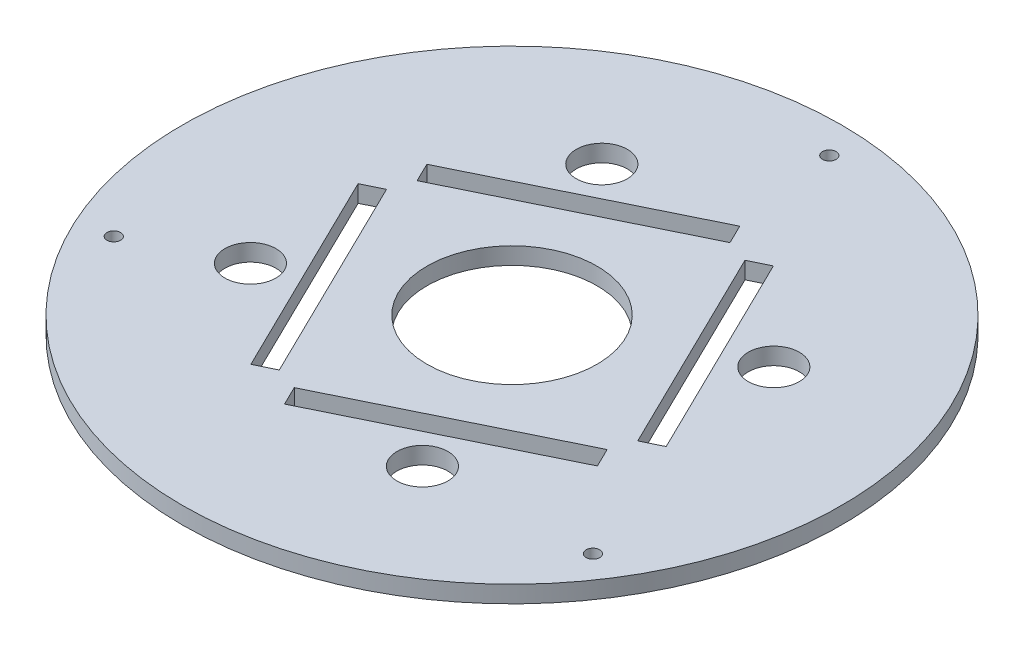
ISO-10303-21;
HEADER;
FILE_DESCRIPTION(('STEP AP214'),'2;1');
FILE_NAME('part.step','',(''),(''),'','','');
FILE_SCHEMA(('AUTOMOTIVE_DESIGN { 1 0 10303 214 1 1 1 1 }'));
ENDSEC;
DATA;
#1=APPLICATION_CONTEXT('core data for automotive mechanical design processes');
#2=APPLICATION_PROTOCOL_DEFINITION('international standard','automotive_design',2000,#1);
#3=PRODUCT_CONTEXT('',#1,'mechanical');
#4=PRODUCT('Part','Part','',(#3));
#5=PRODUCT_RELATED_PRODUCT_CATEGORY('part','',(#4));
#6=PRODUCT_DEFINITION_FORMATION('','',#4);
#7=PRODUCT_DEFINITION_CONTEXT('part definition',#1,'design');
#8=PRODUCT_DEFINITION('design','',#6,#7);
#9=PRODUCT_DEFINITION_SHAPE('','',#8);
#10=(LENGTH_UNIT() NAMED_UNIT(*) SI_UNIT(.MILLI.,.METRE.));
#11=(NAMED_UNIT(*) PLANE_ANGLE_UNIT() SI_UNIT($,.RADIAN.));
#12=(NAMED_UNIT(*) SI_UNIT($,.STERADIAN.) SOLID_ANGLE_UNIT());
#13=UNCERTAINTY_MEASURE_WITH_UNIT(LENGTH_MEASURE(1.E-05),#10,'distance_accuracy_value','');
#14=(GEOMETRIC_REPRESENTATION_CONTEXT(3) GLOBAL_UNCERTAINTY_ASSIGNED_CONTEXT((#13)) GLOBAL_UNIT_ASSIGNED_CONTEXT((#10,
#11,#12)) REPRESENTATION_CONTEXT('',''));
#15=CARTESIAN_POINT('',(0.,0.,0.));
#16=DIRECTION('',(0.,0.,1.));
#17=DIRECTION('',(1.,0.,0.));
#18=AXIS2_PLACEMENT_3D('',#15,#16,#17);
#19=CARTESIAN_POINT('',(0.,4.,0.));
#20=DIRECTION('',(0.,1.,0.));
#21=DIRECTION('',(0.,0.,1.));
#22=AXIS2_PLACEMENT_3D('',#19,#20,#21);
#23=PLANE('',#22);
#24=DIRECTION('',(0.898174750265638,0.,-0.439638622035483));
#25=VECTOR('',#24,1.);
#26=CARTESIAN_POINT('',(-16.059293778768,4.,-32.8088831513608));
#27=LINE('',#26,#25);
#28=CARTESIAN_POINT('',(-40.7461124753904,4.,-20.7251778913177));
#29=VERTEX_POINT('',#28);
#30=CARTESIAN_POINT('',(8.65349878921968,4.,-44.9053021032692));
#31=VERTEX_POINT('',#30);
#32=EDGE_CURVE('E316',#29,#31,#27,.T.);
#33=ORIENTED_EDGE('',*,*,#32,.T.);
#34=DIRECTION('',(0.439638622035483,0.,0.898174750265639));
#35=VECTOR('',#34,1.);
#36=CARTESIAN_POINT('',(24.7127925679877,4.,-12.0964189519083));
#37=LINE('',#36,#35);
#38=CARTESIAN_POINT('',(10.8516918993971,4.,-40.414428351941));
#39=VERTEX_POINT('',#38);
#40=EDGE_CURVE('E319',#31,#39,#37,.T.);
#41=ORIENTED_EDGE('',*,*,#40,.T.);
#42=DIRECTION('',(-0.898174750265638,0.,0.439638622035484));
#43=VECTOR('',#42,1.);
#44=CARTESIAN_POINT('',(-13.8611006685906,4.,-28.3180094000327));
#45=LINE('',#44,#43);
#46=CARTESIAN_POINT('',(-38.547919365213,4.,-16.2343041399895));
#47=VERTEX_POINT('',#46);
#48=EDGE_CURVE('E177',#39,#47,#45,.T.);
#49=ORIENTED_EDGE('',*,*,#48,.T.);
#50=DIRECTION('',(-0.439638622035485,0.,-0.898174750265638));
#51=VECTOR('',#50,1.);
#52=CARTESIAN_POINT('',(-24.6868186966223,4.,12.0837052600432));
#53=LINE('',#52,#51);
#54=EDGE_CURVE('E323',#47,#29,#53,.T.);
#55=ORIENTED_EDGE('',*,*,#54,.T.);
#56=EDGE_LOOP('',(#33,#41,#49,#55));
#57=FACE_BOUND('',#56,.T.);
#58=CARTESIAN_POINT('',(-20.2213778980543,4.,-41.3448441180183));
#59=DIRECTION('',(0.,-1.,0.));
#60=DIRECTION('',(0.,0.,-1.));
#61=AXIS2_PLACEMENT_3D('',#58,#59,#60);
#62=CIRCLE('',#61,6.);
#63=CARTESIAN_POINT('',(-20.2213778980543,4.,-47.3448441180183));
#64=VERTEX_POINT('',#63);
#65=EDGE_CURVE('E313',#64,#64,#62,.T.);
#66=ORIENTED_EDGE('',*,*,#65,.T.);
#67=EDGE_LOOP('',(#66));
#68=FACE_BOUND('',#67,.T.);
#69=DIRECTION('',(0.439638622035483,0.,0.898174750265638));
#70=VECTOR('',#69,1.);
#71=CARTESIAN_POINT('',(32.7994213271886,4.,-16.0546624045952));
#72=LINE('',#71,#70);
#73=CARTESIAN_POINT('',(20.6983710011053,4.,-40.7769167967594));
#74=VERTEX_POINT('',#73);
#75=CARTESIAN_POINT('',(44.8784952130569,4.,8.62269446785068));
#76=VERTEX_POINT('',#75);
#77=EDGE_CURVE('E282',#74,#76,#72,.T.);
#78=ORIENTED_EDGE('',*,*,#77,.T.);
#79=DIRECTION('',(-0.898174750265639,0.,0.439638622035482));
#80=VECTOR('',#79,1.);
#81=CARTESIAN_POINT('',(12.0790738858683,4.,24.6773568724459));
#82=LINE('',#81,#80);
#83=CARTESIAN_POINT('',(40.3876214617287,4.,10.8208875780281));
#84=VERTEX_POINT('',#83);
#85=EDGE_CURVE('E292',#76,#84,#82,.T.);
#86=ORIENTED_EDGE('',*,*,#85,.T.);
#87=DIRECTION('',(-0.439638622035484,0.,-0.898174750265638));
#88=VECTOR('',#87,1.);
#89=CARTESIAN_POINT('',(28.3085475758604,4.,-13.8564692944178));
#90=LINE('',#89,#88);
#91=CARTESIAN_POINT('',(16.2074972497772,4.,-38.578723686582));
#92=VERTEX_POINT('',#91);
#93=EDGE_CURVE('E185',#84,#92,#90,.T.);
#94=ORIENTED_EDGE('',*,*,#93,.T.);
#95=DIRECTION('',(0.898174750265638,0.,-0.439638622035485));
#96=VECTOR('',#95,1.);
#97=CARTESIAN_POINT('',(-12.1010503260833,4.,-24.7222543921641));
#98=LINE('',#97,#96);
#99=EDGE_CURVE('E289',#92,#74,#98,.T.);
#100=ORIENTED_EDGE('',*,*,#99,.T.);
#101=EDGE_LOOP('',(#78,#86,#94,#100));
#102=FACE_BOUND('',#101,.T.);
#103=CARTESIAN_POINT('',(41.3180372277958,4.,-20.252182219432));
#104=DIRECTION('',(0.,-1.,0.));
#105=DIRECTION('',(0.,0.,-1.));
#106=AXIS2_PLACEMENT_3D('',#103,#104,#105);
#107=CIRCLE('',#106,6.);
#108=CARTESIAN_POINT('',(41.3180372277958,4.,-26.252182219432));
#109=VERTEX_POINT('',#108);
#110=EDGE_CURVE('E298',#109,#109,#107,.T.);
#111=ORIENTED_EDGE('',*,*,#110,.T.);
#112=EDGE_LOOP('',(#111));
#113=FACE_BOUND('',#112,.T.);
#114=CARTESIAN_POINT('',(20.2253753292099,4.,41.2872329064176));
#115=DIRECTION('',(0.,-1.,0.));
#116=DIRECTION('',(0.,0.,-1.));
#117=AXIS2_PLACEMENT_3D('',#114,#115,#116);
#118=CIRCLE('',#117,6.00000000000001);
#119=CARTESIAN_POINT('',(20.2253753292099,4.,35.2872329064176));
#120=VERTEX_POINT('',#119);
#121=EDGE_CURVE('E339',#120,#120,#118,.T.);
#122=ORIENTED_EDGE('',*,*,#121,.T.);
#123=EDGE_LOOP('',(#122));
#124=FACE_BOUND('',#123,.T.);
#125=DIRECTION('',(0.898174750265637,0.,-0.439638622035486));
#126=VECTOR('',#125,1.);
#127=CARTESIAN_POINT('',(13.8391242283778,4.,28.2731118803185));
#128=LINE('',#127,#126);
#129=CARTESIAN_POINT('',(-10.8476944682404,4.,40.3568171403597));
#130=VERTEX_POINT('',#129);
#131=CARTESIAN_POINT('',(38.5519167963697,4.,16.176692928408));
#132=VERTEX_POINT('',#131);
#133=EDGE_CURVE('E308',#130,#132,#128,.T.);
#134=ORIENTED_EDGE('',*,*,#133,.T.);
#135=DIRECTION('',(0.439638622035485,0.,0.898174750265638));
#136=VECTOR('',#135,1.);
#137=CARTESIAN_POINT('',(24.7127925679919,4.,-12.0964189519105));
#138=LINE('',#137,#136);
#139=CARTESIAN_POINT('',(40.7501099065471,4.,20.6675666797362));
#140=VERTEX_POINT('',#139);
#141=EDGE_CURVE('E362',#132,#140,#138,.T.);
#142=ORIENTED_EDGE('',*,*,#141,.T.);
#143=DIRECTION('',(-0.898174750265637,0.,0.439638622035486));
#144=VECTOR('',#143,1.);
#145=CARTESIAN_POINT('',(16.0373173385552,4.,32.7639856316467));
#146=LINE('',#145,#144);
#147=CARTESIAN_POINT('',(-8.64950135806294,4.,44.8476908916879));
#148=VERTEX_POINT('',#147);
#149=EDGE_CURVE('E365',#140,#148,#146,.T.);
#150=ORIENTED_EDGE('',*,*,#149,.T.);
#151=DIRECTION('',(-0.439638622035489,0.,-0.898174750265636));
#152=VECTOR('',#151,1.);
#153=CARTESIAN_POINT('',(-24.6868186966182,4.,12.0837052600413));
#154=LINE('',#153,#152);
#155=EDGE_CURVE('E368',#148,#130,#154,.T.);
#156=ORIENTED_EDGE('',*,*,#155,.T.);
#157=EDGE_LOOP('',(#134,#142,#150,#156));
#158=FACE_BOUND('',#157,.T.);
#159=DIRECTION('',(-0.439638622035483,0.,-0.898174750265638));
#160=VECTOR('',#159,1.);
#161=CARTESIAN_POINT('',(-32.7734474558191,4.,16.041948712728));
#162=LINE('',#161,#160);
#163=CARTESIAN_POINT('',(-20.6943735699487,4.,40.7193055851781));
#164=VERTEX_POINT('',#163);
#165=CARTESIAN_POINT('',(-44.8744977819002,4.,-8.680305679432));
#166=VERTEX_POINT('',#165);
#167=EDGE_CURVE('E335',#164,#166,#162,.T.);
#168=ORIENTED_EDGE('',*,*,#167,.T.);
#169=DIRECTION('',(0.898174750265638,0.,-0.439638622035483));
#170=VECTOR('',#169,1.);
#171=CARTESIAN_POINT('',(-12.1010503260812,4.,-24.7222543921599));
#172=LINE('',#171,#170);
#173=CARTESIAN_POINT('',(-40.3836240305721,4.,-10.8784987896094));
#174=VERTEX_POINT('',#173);
#175=EDGE_CURVE('E338',#166,#174,#172,.T.);
#176=ORIENTED_EDGE('',*,*,#175,.T.);
#177=DIRECTION('',(0.439638622035483,0.,0.898174750265638));
#178=VECTOR('',#177,1.);
#179=CARTESIAN_POINT('',(-28.2825737044909,4.,13.8437556025505));
#180=LINE('',#179,#178);
#181=CARTESIAN_POINT('',(-16.2034998186205,4.,38.5211124750007));
#182=VERTEX_POINT('',#181);
#183=EDGE_CURVE('E342',#174,#182,#180,.T.);
#184=ORIENTED_EDGE('',*,*,#183,.T.);
#185=DIRECTION('',(-0.898174750265638,0.,0.439638622035484));
#186=VECTOR('',#185,1.);
#187=CARTESIAN_POINT('',(12.0790738858704,4.,24.6773568724501));
#188=LINE('',#187,#186);
#189=EDGE_CURVE('E345',#182,#164,#188,.T.);
#190=ORIENTED_EDGE('',*,*,#189,.T.);
#191=EDGE_LOOP('',(#168,#176,#184,#190));
#192=FACE_BOUND('',#191,.T.);
#193=CARTESIAN_POINT('',(-41.3140397966403,4.,20.1945710078318));
#194=DIRECTION('',(0.,-1.,0.));
#195=DIRECTION('',(0.,0.,-1.));
#196=AXIS2_PLACEMENT_3D('',#193,#194,#195);
#197=CIRCLE('',#196,6.);
#198=CARTESIAN_POINT('',(-41.3140397966403,4.,14.1945710078318));
#199=VERTEX_POINT('',#198);
#200=EDGE_CURVE('E384',#199,#199,#197,.T.);
#201=ORIENTED_EDGE('',*,*,#200,.T.);
#202=EDGE_LOOP('',(#201));
#203=FACE_BOUND('',#202,.T.);
#204=CARTESIAN_POINT('',(0.,4.,0.));
#205=DIRECTION('',(0.,1.,0.));
#206=DIRECTION('',(0.,0.,1.));
#207=AXIS2_PLACEMENT_3D('',#204,#205,#206);
#208=CIRCLE('',#207,20.);
#209=CARTESIAN_POINT('',(0.,4.,20.));
#210=VERTEX_POINT('',#209);
#211=EDGE_CURVE('E394',#210,#210,#208,.T.);
#212=ORIENTED_EDGE('',*,*,#211,.F.);
#213=EDGE_LOOP('',(#212));
#214=FACE_BOUND('',#213,.T.);
#215=CARTESIAN_POINT('',(-62.8722325185947,4.,30.7747035424855));
#216=DIRECTION('',(0.,1.,0.));
#217=DIRECTION('',(0.,0.,1.));
#218=AXIS2_PLACEMENT_3D('',#215,#216,#217);
#219=CIRCLE('',#218,1.60000000000066);
#220=CARTESIAN_POINT('',(-62.8722325185947,4.,32.3747035424862));
#221=VERTEX_POINT('',#220);
#222=EDGE_CURVE('E652',#221,#221,#219,.T.);
#223=ORIENTED_EDGE('',*,*,#222,.F.);
#224=EDGE_LOOP('',(#223));
#225=FACE_BOUND('',#224,.T.);
#226=CARTESIAN_POINT('',(0.,4.,0.));
#227=DIRECTION('',(0.,1.,0.));
#228=DIRECTION('',(0.,0.,1.));
#229=AXIS2_PLACEMENT_3D('',#226,#227,#228);
#230=CIRCLE('',#229,77.5);
#231=CARTESIAN_POINT('',(0.,4.,77.5));
#232=VERTEX_POINT('',#231);
#233=EDGE_CURVE('E409',#232,#232,#230,.T.);
#234=ORIENTED_EDGE('',*,*,#233,.T.);
#235=EDGE_LOOP('',(#234));
#236=FACE_BOUND('',#235,.T.);
#237=CARTESIAN_POINT('',(4.78444119756972,4.,-69.8363023249864));
#238=DIRECTION('',(0.,1.,0.));
#239=DIRECTION('',(0.,0.,1.));
#240=AXIS2_PLACEMENT_3D('',#237,#238,#239);
#241=CIRCLE('',#240,1.60000000000062);
#242=CARTESIAN_POINT('',(4.78444119756972,4.,-68.2363023249858));
#243=VERTEX_POINT('',#242);
#244=EDGE_CURVE('E410',#243,#243,#241,.T.);
#245=ORIENTED_EDGE('',*,*,#244,.F.);
#246=EDGE_LOOP('',(#245));
#247=FACE_BOUND('',#246,.T.);
#248=CARTESIAN_POINT('',(58.0877913210235,4.,39.0615987825028));
#249=DIRECTION('',(0.,1.,0.));
#250=DIRECTION('',(0.,0.,1.));
#251=AXIS2_PLACEMENT_3D('',#248,#249,#250);
#252=CIRCLE('',#251,1.60000000000067);
#253=CARTESIAN_POINT('',(58.0877913210235,4.,40.6615987825035));
#254=VERTEX_POINT('',#253);
#255=EDGE_CURVE('E646',#254,#254,#252,.T.);
#256=ORIENTED_EDGE('',*,*,#255,.F.);
#257=EDGE_LOOP('',(#256));
#258=FACE_BOUND('',#257,.T.);
#259=ADVANCED_FACE('F160',(#57,#68,#102,#113,#124,#158,#192,#203,#214,#225,#236,#247,#258),#23,.T.);
#260=CARTESIAN_POINT('',(0.,0.,0.));
#261=DIRECTION('',(0.,1.,0.));
#262=DIRECTION('',(0.,0.,1.));
#263=AXIS2_PLACEMENT_3D('',#260,#261,#262);
#264=PLANE('',#263);
#265=DIRECTION('',(-0.439638622035483,0.,-0.898174750265639));
#266=VECTOR('',#265,1.);
#267=CARTESIAN_POINT('',(24.7127925679877,0.,-12.0964189519083));
#268=LINE('',#267,#266);
#269=CARTESIAN_POINT('',(10.8516918993971,0.,-40.414428351941));
#270=VERTEX_POINT('',#269);
#271=CARTESIAN_POINT('',(8.65349878921969,0.,-44.9053021032692));
#272=VERTEX_POINT('',#271);
#273=EDGE_CURVE('E484',#270,#272,#268,.T.);
#274=ORIENTED_EDGE('',*,*,#273,.T.);
#275=DIRECTION('',(-0.898174750265638,0.,0.439638622035483));
#276=VECTOR('',#275,1.);
#277=CARTESIAN_POINT('',(-16.059293778768,0.,-32.8088831513608));
#278=LINE('',#277,#276);
#279=CARTESIAN_POINT('',(-40.7461124753904,0.,-20.7251778913177));
#280=VERTEX_POINT('',#279);
#281=EDGE_CURVE('E13',#272,#280,#278,.T.);
#282=ORIENTED_EDGE('',*,*,#281,.T.);
#283=DIRECTION('',(0.439638622035485,0.,0.898174750265638));
#284=VECTOR('',#283,1.);
#285=CARTESIAN_POINT('',(-24.6868186966223,0.,12.0837052600432));
#286=LINE('',#285,#284);
#287=CARTESIAN_POINT('',(-38.547919365213,0.,-16.2343041399895));
#288=VERTEX_POINT('',#287);
#289=EDGE_CURVE('E170',#280,#288,#286,.T.);
#290=ORIENTED_EDGE('',*,*,#289,.T.);
#291=DIRECTION('',(0.898174750265638,0.,-0.439638622035484));
#292=VECTOR('',#291,1.);
#293=CARTESIAN_POINT('',(-13.8611006685906,0.,-28.3180094000327));
#294=LINE('',#293,#292);
#295=EDGE_CURVE('E493',#288,#270,#294,.T.);
#296=ORIENTED_EDGE('',*,*,#295,.T.);
#297=EDGE_LOOP('',(#274,#282,#290,#296));
#298=FACE_BOUND('',#297,.T.);
#299=CARTESIAN_POINT('',(-20.2213778980543,0.,-41.3448441180183));
#300=DIRECTION('',(0.,1.,0.));
#301=DIRECTION('',(0.,0.,1.));
#302=AXIS2_PLACEMENT_3D('',#299,#300,#301);
#303=CIRCLE('',#302,6.);
#304=CARTESIAN_POINT('',(-20.2213778980543,0.,-35.3448441180183));
#305=VERTEX_POINT('',#304);
#306=EDGE_CURVE('E388',#305,#305,#303,.T.);
#307=ORIENTED_EDGE('',*,*,#306,.T.);
#308=EDGE_LOOP('',(#307));
#309=FACE_BOUND('',#308,.T.);
#310=DIRECTION('',(0.898174750265639,0.,-0.439638622035482));
#311=VECTOR('',#310,1.);
#312=CARTESIAN_POINT('',(12.0790738858683,0.,24.6773568724459));
#313=LINE('',#312,#311);
#314=CARTESIAN_POINT('',(40.3876214617287,0.,10.8208875780281));
#315=VERTEX_POINT('',#314);
#316=CARTESIAN_POINT('',(44.8784952130569,0.,8.62269446785067));
#317=VERTEX_POINT('',#316);
#318=EDGE_CURVE('E454',#315,#317,#313,.T.);
#319=ORIENTED_EDGE('',*,*,#318,.T.);
#320=DIRECTION('',(-0.439638622035483,0.,-0.898174750265638));
#321=VECTOR('',#320,1.);
#322=CARTESIAN_POINT('',(32.7994213271886,0.,-16.0546624045952));
#323=LINE('',#322,#321);
#324=CARTESIAN_POINT('',(20.6983710011053,0.,-40.7769167967594));
#325=VERTEX_POINT('',#324);
#326=EDGE_CURVE('E285',#317,#325,#323,.T.);
#327=ORIENTED_EDGE('',*,*,#326,.T.);
#328=DIRECTION('',(-0.898174750265638,0.,0.439638622035485));
#329=VECTOR('',#328,1.);
#330=CARTESIAN_POINT('',(-12.1010503260833,0.,-24.7222543921641));
#331=LINE('',#330,#329);
#332=CARTESIAN_POINT('',(16.2074972497772,0.,-38.578723686582));
#333=VERTEX_POINT('',#332);
#334=EDGE_CURVE('E476',#325,#333,#331,.T.);
#335=ORIENTED_EDGE('',*,*,#334,.T.);
#336=DIRECTION('',(0.439638622035484,0.,0.898174750265638));
#337=VECTOR('',#336,1.);
#338=CARTESIAN_POINT('',(28.3085475758604,0.,-13.8564692944178));
#339=LINE('',#338,#337);
#340=EDGE_CURVE('E472',#333,#315,#339,.T.);
#341=ORIENTED_EDGE('',*,*,#340,.T.);
#342=EDGE_LOOP('',(#319,#327,#335,#341));
#343=FACE_BOUND('',#342,.T.);
#344=CARTESIAN_POINT('',(41.3180372277958,0.,-20.252182219432));
#345=DIRECTION('',(0.,1.,0.));
#346=DIRECTION('',(0.,0.,1.));
#347=AXIS2_PLACEMENT_3D('',#344,#345,#346);
#348=CIRCLE('',#347,6.);
#349=CARTESIAN_POINT('',(41.3180372277958,0.,-14.252182219432));
#350=VERTEX_POINT('',#349);
#351=EDGE_CURVE('E461',#350,#350,#348,.T.);
#352=ORIENTED_EDGE('',*,*,#351,.T.);
#353=EDGE_LOOP('',(#352));
#354=FACE_BOUND('',#353,.T.);
#355=CARTESIAN_POINT('',(20.2253753292099,0.,41.2872329064176));
#356=DIRECTION('',(0.,1.,0.));
#357=DIRECTION('',(0.,0.,1.));
#358=AXIS2_PLACEMENT_3D('',#355,#356,#357);
#359=CIRCLE('',#358,6.00000000000001);
#360=CARTESIAN_POINT('',(20.2253753292099,0.,47.2872329064177));
#361=VERTEX_POINT('',#360);
#362=EDGE_CURVE('E352',#361,#361,#359,.T.);
#363=ORIENTED_EDGE('',*,*,#362,.T.);
#364=EDGE_LOOP('',(#363));
#365=FACE_BOUND('',#364,.T.);
#366=DIRECTION('',(-0.439638622035485,0.,-0.898174750265638));
#367=VECTOR('',#366,1.);
#368=CARTESIAN_POINT('',(24.7127925679919,0.,-12.0964189519105));
#369=LINE('',#368,#367);
#370=CARTESIAN_POINT('',(40.7501099065471,0.,20.6675666797362));
#371=VERTEX_POINT('',#370);
#372=CARTESIAN_POINT('',(38.5519167963697,0.,16.176692928408));
#373=VERTEX_POINT('',#372);
#374=EDGE_CURVE('E435',#371,#373,#369,.T.);
#375=ORIENTED_EDGE('',*,*,#374,.T.);
#376=DIRECTION('',(-0.898174750265637,0.,0.439638622035486));
#377=VECTOR('',#376,1.);
#378=CARTESIAN_POINT('',(13.8391242283778,0.,28.2731118803185));
#379=LINE('',#378,#377);
#380=CARTESIAN_POINT('',(-10.8476944682404,0.,40.3568171403597));
#381=VERTEX_POINT('',#380);
#382=EDGE_CURVE('E450',#373,#381,#379,.T.);
#383=ORIENTED_EDGE('',*,*,#382,.T.);
#384=DIRECTION('',(0.439638622035489,0.,0.898174750265636));
#385=VECTOR('',#384,1.);
#386=CARTESIAN_POINT('',(-24.6868186966182,0.,12.0837052600413));
#387=LINE('',#386,#385);
#388=CARTESIAN_POINT('',(-8.64950135806294,0.,44.8476908916879));
#389=VERTEX_POINT('',#388);
#390=EDGE_CURVE('E455',#381,#389,#387,.T.);
#391=ORIENTED_EDGE('',*,*,#390,.T.);
#392=DIRECTION('',(0.898174750265637,0.,-0.439638622035486));
#393=VECTOR('',#392,1.);
#394=CARTESIAN_POINT('',(16.0373173385552,0.,32.7639856316467));
#395=LINE('',#394,#393);
#396=EDGE_CURVE('E441',#389,#371,#395,.T.);
#397=ORIENTED_EDGE('',*,*,#396,.T.);
#398=EDGE_LOOP('',(#375,#383,#391,#397));
#399=FACE_BOUND('',#398,.T.);
#400=DIRECTION('',(-0.898174750265638,0.,0.439638622035483));
#401=VECTOR('',#400,1.);
#402=CARTESIAN_POINT('',(-12.1010503260812,0.,-24.7222543921599));
#403=LINE('',#402,#401);
#404=CARTESIAN_POINT('',(-40.3836240305721,0.,-10.8784987896094));
#405=VERTEX_POINT('',#404);
#406=CARTESIAN_POINT('',(-44.8744977819002,0.,-8.68030567943199));
#407=VERTEX_POINT('',#406);
#408=EDGE_CURVE('E415',#405,#407,#403,.T.);
#409=ORIENTED_EDGE('',*,*,#408,.T.);
#410=DIRECTION('',(0.439638622035483,0.,0.898174750265638));
#411=VECTOR('',#410,1.);
#412=CARTESIAN_POINT('',(-32.7734474558191,0.,16.041948712728));
#413=LINE('',#412,#411);
#414=CARTESIAN_POINT('',(-20.6943735699487,0.,40.7193055851781));
#415=VERTEX_POINT('',#414);
#416=EDGE_CURVE('E430',#407,#415,#413,.T.);
#417=ORIENTED_EDGE('',*,*,#416,.T.);
#418=DIRECTION('',(0.898174750265638,0.,-0.439638622035484));
#419=VECTOR('',#418,1.);
#420=CARTESIAN_POINT('',(12.0790738858704,0.,24.6773568724501));
#421=LINE('',#420,#419);
#422=CARTESIAN_POINT('',(-16.2034998186205,0.,38.5211124750007));
#423=VERTEX_POINT('',#422);
#424=EDGE_CURVE('E436',#415,#423,#421,.T.);
#425=ORIENTED_EDGE('',*,*,#424,.T.);
#426=DIRECTION('',(-0.439638622035484,0.,-0.898174750265638));
#427=VECTOR('',#426,1.);
#428=CARTESIAN_POINT('',(-28.2825737044909,0.,13.8437556025506));
#429=LINE('',#428,#427);
#430=EDGE_CURVE('E420',#423,#405,#429,.T.);
#431=ORIENTED_EDGE('',*,*,#430,.T.);
#432=EDGE_LOOP('',(#409,#417,#425,#431));
#433=FACE_BOUND('',#432,.T.);
#434=CARTESIAN_POINT('',(-41.3140397966403,0.,20.1945710078318));
#435=DIRECTION('',(0.,1.,0.));
#436=DIRECTION('',(0.,0.,1.));
#437=AXIS2_PLACEMENT_3D('',#434,#435,#436);
#438=CIRCLE('',#437,6.);
#439=CARTESIAN_POINT('',(-41.3140397966403,0.,26.1945710078318));
#440=VERTEX_POINT('',#439);
#441=EDGE_CURVE('E387',#440,#440,#438,.T.);
#442=ORIENTED_EDGE('',*,*,#441,.T.);
#443=EDGE_LOOP('',(#442));
#444=FACE_BOUND('',#443,.T.);
#445=CARTESIAN_POINT('',(0.,0.,0.));
#446=DIRECTION('',(0.,1.,0.));
#447=DIRECTION('',(0.,0.,1.));
#448=AXIS2_PLACEMENT_3D('',#445,#446,#447);
#449=CIRCLE('',#448,20.);
#450=CARTESIAN_POINT('',(0.,0.,20.));
#451=VERTEX_POINT('',#450);
#452=EDGE_CURVE('E389',#451,#451,#449,.T.);
#453=ORIENTED_EDGE('',*,*,#452,.T.);
#454=EDGE_LOOP('',(#453));
#455=FACE_BOUND('',#454,.T.);
#456=CARTESIAN_POINT('',(0.,0.,0.));
#457=DIRECTION('',(0.,1.,0.));
#458=DIRECTION('',(0.,0.,1.));
#459=AXIS2_PLACEMENT_3D('',#456,#457,#458);
#460=CIRCLE('',#459,77.5);
#461=CARTESIAN_POINT('',(0.,0.,77.5));
#462=VERTEX_POINT('',#461);
#463=EDGE_CURVE('E404',#462,#462,#460,.T.);
#464=ORIENTED_EDGE('',*,*,#463,.F.);
#465=EDGE_LOOP('',(#464));
#466=FACE_BOUND('',#465,.T.);
#467=CARTESIAN_POINT('',(4.78444119756972,0.,-69.8363023249864));
#468=DIRECTION('',(0.,1.,0.));
#469=DIRECTION('',(0.,0.,1.));
#470=AXIS2_PLACEMENT_3D('',#467,#468,#469);
#471=CIRCLE('',#470,1.60000000000062);
#472=CARTESIAN_POINT('',(4.78444119756972,0.,-68.2363023249858));
#473=VERTEX_POINT('',#472);
#474=EDGE_CURVE('E636',#473,#473,#471,.T.);
#475=ORIENTED_EDGE('',*,*,#474,.T.);
#476=EDGE_LOOP('',(#475));
#477=FACE_BOUND('',#476,.T.);
#478=CARTESIAN_POINT('',(-62.8722325185947,0.,30.7747035424855));
#479=DIRECTION('',(0.,1.,0.));
#480=DIRECTION('',(0.,0.,1.));
#481=AXIS2_PLACEMENT_3D('',#478,#479,#480);
#482=CIRCLE('',#481,1.60000000000066);
#483=CARTESIAN_POINT('',(-62.8722325185947,0.,32.3747035424862));
#484=VERTEX_POINT('',#483);
#485=EDGE_CURVE('E640',#484,#484,#482,.T.);
#486=ORIENTED_EDGE('',*,*,#485,.T.);
#487=EDGE_LOOP('',(#486));
#488=FACE_BOUND('',#487,.T.);
#489=CARTESIAN_POINT('',(58.0877913210235,0.,39.0615987825028));
#490=DIRECTION('',(0.,1.,0.));
#491=DIRECTION('',(0.,0.,1.));
#492=AXIS2_PLACEMENT_3D('',#489,#490,#491);
#493=CIRCLE('',#492,1.60000000000067);
#494=CARTESIAN_POINT('',(58.0877913210235,0.,40.6615987825035));
#495=VERTEX_POINT('',#494);
#496=EDGE_CURVE('E643',#495,#495,#493,.T.);
#497=ORIENTED_EDGE('',*,*,#496,.T.);
#498=EDGE_LOOP('',(#497));
#499=FACE_BOUND('',#498,.T.);
#500=ADVANCED_FACE('F503',(#298,#309,#343,#354,#365,#399,#433,#444,#455,#466,#477,#488,#499),
#264,.F.);
#501=CARTESIAN_POINT('',(0.,4.,0.));
#502=DIRECTION('',(0.,-1.,0.));
#503=DIRECTION('',(0.,0.,-1.));
#504=AXIS2_PLACEMENT_3D('',#501,#502,#503);
#505=CYLINDRICAL_SURFACE('',#504,77.5);
#506=ORIENTED_EDGE('',*,*,#233,.F.);
#507=EDGE_LOOP('',(#506));
#508=FACE_BOUND('',#507,.T.);
#509=ORIENTED_EDGE('',*,*,#463,.T.);
#510=EDGE_LOOP('',(#509));
#511=FACE_BOUND('',#510,.T.);
#512=ADVANCED_FACE('F162',(#508,#511),#505,.T.);
#513=CARTESIAN_POINT('',(4.78444119756972,4.,-69.8363023249864));
#514=DIRECTION('',(0.,-1.,0.));
#515=DIRECTION('',(0.,0.,-1.));
#516=AXIS2_PLACEMENT_3D('',#513,#514,#515);
#517=CYLINDRICAL_SURFACE('',#516,1.60000000000062);
#518=ORIENTED_EDGE('',*,*,#244,.T.);
#519=EDGE_LOOP('',(#518));
#520=FACE_BOUND('',#519,.T.);
#521=ORIENTED_EDGE('',*,*,#474,.F.);
#522=EDGE_LOOP('',(#521));
#523=FACE_BOUND('',#522,.T.);
#524=ADVANCED_FACE('F532',(#520,#523),#517,.F.);
#525=CARTESIAN_POINT('',(-62.8722325185947,4.,30.7747035424855));
#526=DIRECTION('',(0.,-1.,0.));
#527=DIRECTION('',(0.,0.,-1.));
#528=AXIS2_PLACEMENT_3D('',#525,#526,#527);
#529=CYLINDRICAL_SURFACE('',#528,1.60000000000066);
#530=ORIENTED_EDGE('',*,*,#222,.T.);
#531=EDGE_LOOP('',(#530));
#532=FACE_BOUND('',#531,.T.);
#533=ORIENTED_EDGE('',*,*,#485,.F.);
#534=EDGE_LOOP('',(#533));
#535=FACE_BOUND('',#534,.T.);
#536=ADVANCED_FACE('F535',(#532,#535),#529,.F.);
#537=CARTESIAN_POINT('',(58.0877913210235,4.,39.0615987825028));
#538=DIRECTION('',(0.,-1.,0.));
#539=DIRECTION('',(0.,0.,-1.));
#540=AXIS2_PLACEMENT_3D('',#537,#538,#539);
#541=CYLINDRICAL_SURFACE('',#540,1.60000000000067);
#542=ORIENTED_EDGE('',*,*,#255,.T.);
#543=EDGE_LOOP('',(#542));
#544=FACE_BOUND('',#543,.T.);
#545=ORIENTED_EDGE('',*,*,#496,.F.);
#546=EDGE_LOOP('',(#545));
#547=FACE_BOUND('',#546,.T.);
#548=ADVANCED_FACE('F539',(#544,#547),#541,.F.);
#549=CARTESIAN_POINT('',(0.,0.,0.));
#550=DIRECTION('',(0.,1.,0.));
#551=DIRECTION('',(0.,0.,1.));
#552=AXIS2_PLACEMENT_3D('',#549,#550,#551);
#553=CYLINDRICAL_SURFACE('',#552,20.);
#554=ORIENTED_EDGE('',*,*,#211,.T.);
#555=EDGE_LOOP('',(#554));
#556=FACE_BOUND('',#555,.T.);
#557=ORIENTED_EDGE('',*,*,#452,.F.);
#558=EDGE_LOOP('',(#557));
#559=FACE_BOUND('',#558,.T.);
#560=ADVANCED_FACE('F543',(#556,#559),#553,.F.);
#561=CARTESIAN_POINT('',(-41.3140397966403,4.,20.1945710078318));
#562=DIRECTION('',(0.,-1.,0.));
#563=DIRECTION('',(0.,0.,-1.));
#564=AXIS2_PLACEMENT_3D('',#561,#562,#563);
#565=CYLINDRICAL_SURFACE('',#564,6.);
#566=ORIENTED_EDGE('',*,*,#200,.F.);
#567=EDGE_LOOP('',(#566));
#568=FACE_BOUND('',#567,.T.);
#569=ORIENTED_EDGE('',*,*,#441,.F.);
#570=EDGE_LOOP('',(#569));
#571=FACE_BOUND('',#570,.T.);
#572=ADVANCED_FACE('F547',(#568,#571),#565,.F.);
#573=CARTESIAN_POINT('',(-32.7734474558191,4.,16.041948712728));
#574=DIRECTION('',(-0.898174750265638,0.,0.439638622035483));
#575=DIRECTION('',(0.439638622035483,0.,0.898174750265638));
#576=AXIS2_PLACEMENT_3D('',#573,#574,#575);
#577=PLANE('',#576);
#578=DIRECTION('',(0.,-1.,0.));
#579=VECTOR('',#578,1.);
#580=CARTESIAN_POINT('',(-44.8744977819002,4.,-8.680305679432));
#581=LINE('',#580,#579);
#582=EDGE_CURVE('E348',#166,#407,#581,.T.);
#583=ORIENTED_EDGE('',*,*,#582,.F.);
#584=ORIENTED_EDGE('',*,*,#167,.F.);
#585=DIRECTION('',(0.,-1.,0.));
#586=VECTOR('',#585,1.);
#587=CARTESIAN_POINT('',(-20.6943735699487,4.,40.7193055851781));
#588=LINE('',#587,#586);
#589=EDGE_CURVE('E349',#164,#415,#588,.T.);
#590=ORIENTED_EDGE('',*,*,#589,.T.);
#591=ORIENTED_EDGE('',*,*,#416,.F.);
#592=EDGE_LOOP('',(#583,#584,#590,#591));
#593=FACE_BOUND('',#592,.T.);
#594=ADVANCED_FACE('F551',(#593),#577,.F.);
#595=CARTESIAN_POINT('',(12.0790738858704,4.,24.6773568724501));
#596=DIRECTION('',(0.439638622035484,0.,0.898174750265638));
#597=DIRECTION('',(0.898174750265638,0.,-0.439638622035484));
#598=AXIS2_PLACEMENT_3D('',#595,#596,#597);
#599=PLANE('',#598);
#600=ORIENTED_EDGE('',*,*,#589,.F.);
#601=ORIENTED_EDGE('',*,*,#189,.F.);
#602=DIRECTION('',(0.,-1.,0.));
#603=VECTOR('',#602,1.);
#604=CARTESIAN_POINT('',(-16.2034998186205,4.,38.5211124750007));
#605=LINE('',#604,#603);
#606=EDGE_CURVE('E353',#182,#423,#605,.T.);
#607=ORIENTED_EDGE('',*,*,#606,.T.);
#608=ORIENTED_EDGE('',*,*,#424,.F.);
#609=EDGE_LOOP('',(#600,#601,#607,#608));
#610=FACE_BOUND('',#609,.T.);
#611=ADVANCED_FACE('F577',(#610),#599,.F.);
#612=CARTESIAN_POINT('',(-28.2825737044909,4.,13.8437556025505));
#613=DIRECTION('',(0.898174750265638,0.,-0.439638622035484));
#614=DIRECTION('',(-0.439638622035484,0.,-0.898174750265638));
#615=AXIS2_PLACEMENT_3D('',#612,#613,#614);
#616=PLANE('',#615);
#617=ORIENTED_EDGE('',*,*,#606,.F.);
#618=ORIENTED_EDGE('',*,*,#183,.F.);
#619=DIRECTION('',(0.,-1.,0.));
#620=VECTOR('',#619,1.);
#621=CARTESIAN_POINT('',(-40.3836240305721,4.,-10.8784987896094));
#622=LINE('',#621,#620);
#623=EDGE_CURVE('E356',#174,#405,#622,.T.);
#624=ORIENTED_EDGE('',*,*,#623,.T.);
#625=ORIENTED_EDGE('',*,*,#430,.F.);
#626=EDGE_LOOP('',(#617,#618,#624,#625));
#627=FACE_BOUND('',#626,.T.);
#628=ADVANCED_FACE('F581',(#627),#616,.F.);
#629=CARTESIAN_POINT('',(-12.1010503260812,4.,-24.7222543921599));
#630=DIRECTION('',(-0.439638622035483,0.,-0.898174750265638));
#631=DIRECTION('',(-0.898174750265638,0.,0.439638622035483));
#632=AXIS2_PLACEMENT_3D('',#629,#630,#631);
#633=PLANE('',#632);
#634=ORIENTED_EDGE('',*,*,#623,.F.);
#635=ORIENTED_EDGE('',*,*,#175,.F.);
#636=ORIENTED_EDGE('',*,*,#582,.T.);
#637=ORIENTED_EDGE('',*,*,#408,.F.);
#638=EDGE_LOOP('',(#634,#635,#636,#637));
#639=FACE_BOUND('',#638,.T.);
#640=ADVANCED_FACE('F563',(#639),#633,.F.);
#641=CARTESIAN_POINT('',(13.8391242283778,4.,28.2731118803185));
#642=DIRECTION('',(-0.439638622035486,0.,-0.898174750265637));
#643=DIRECTION('',(-0.898174750265637,0.,0.439638622035486));
#644=AXIS2_PLACEMENT_3D('',#641,#642,#643);
#645=PLANE('',#644);
#646=DIRECTION('',(0.,-1.,0.));
#647=VECTOR('',#646,1.);
#648=CARTESIAN_POINT('',(38.5519167963697,4.,16.176692928408));
#649=LINE('',#648,#647);
#650=EDGE_CURVE('E371',#132,#373,#649,.T.);
#651=ORIENTED_EDGE('',*,*,#650,.F.);
#652=ORIENTED_EDGE('',*,*,#133,.F.);
#653=DIRECTION('',(0.,-1.,0.));
#654=VECTOR('',#653,1.);
#655=CARTESIAN_POINT('',(-10.8476944682404,4.,40.3568171403597));
#656=LINE('',#655,#654);
#657=EDGE_CURVE('E372',#130,#381,#656,.T.);
#658=ORIENTED_EDGE('',*,*,#657,.T.);
#659=ORIENTED_EDGE('',*,*,#382,.F.);
#660=EDGE_LOOP('',(#651,#652,#658,#659));
#661=FACE_BOUND('',#660,.T.);
#662=ADVANCED_FACE('F559',(#661),#645,.F.);
#663=CARTESIAN_POINT('',(-24.6868186966182,4.,12.0837052600413));
#664=DIRECTION('',(-0.898174750265636,0.,0.439638622035489));
#665=DIRECTION('',(0.439638622035489,0.,0.898174750265636));
#666=AXIS2_PLACEMENT_3D('',#663,#664,#665);
#667=PLANE('',#666);
#668=ORIENTED_EDGE('',*,*,#657,.F.);
#669=ORIENTED_EDGE('',*,*,#155,.F.);
#670=DIRECTION('',(0.,-1.,0.));
#671=VECTOR('',#670,1.);
#672=CARTESIAN_POINT('',(-8.64950135806294,4.,44.8476908916879));
#673=LINE('',#672,#671);
#674=EDGE_CURVE('E375',#148,#389,#673,.T.);
#675=ORIENTED_EDGE('',*,*,#674,.T.);
#676=ORIENTED_EDGE('',*,*,#390,.F.);
#677=EDGE_LOOP('',(#668,#669,#675,#676));
#678=FACE_BOUND('',#677,.T.);
#679=ADVANCED_FACE('F562',(#678),#667,.F.);
#680=CARTESIAN_POINT('',(16.0373173385552,4.,32.7639856316467));
#681=DIRECTION('',(0.439638622035486,0.,0.898174750265637));
#682=DIRECTION('',(0.898174750265637,0.,-0.439638622035486));
#683=AXIS2_PLACEMENT_3D('',#680,#681,#682);
#684=PLANE('',#683);
#685=ORIENTED_EDGE('',*,*,#674,.F.);
#686=ORIENTED_EDGE('',*,*,#149,.F.);
#687=DIRECTION('',(0.,-1.,0.));
#688=VECTOR('',#687,1.);
#689=CARTESIAN_POINT('',(40.7501099065471,4.,20.6675666797362));
#690=LINE('',#689,#688);
#691=EDGE_CURVE('E378',#140,#371,#690,.T.);
#692=ORIENTED_EDGE('',*,*,#691,.T.);
#693=ORIENTED_EDGE('',*,*,#396,.F.);
#694=EDGE_LOOP('',(#685,#686,#692,#693));
#695=FACE_BOUND('',#694,.T.);
#696=ADVANCED_FACE('F567',(#695),#684,.F.);
#697=CARTESIAN_POINT('',(24.7127925679919,4.,-12.0964189519105));
#698=DIRECTION('',(0.898174750265637,0.,-0.439638622035485));
#699=DIRECTION('',(-0.439638622035485,0.,-0.898174750265638));
#700=AXIS2_PLACEMENT_3D('',#697,#698,#699);
#701=PLANE('',#700);
#702=ORIENTED_EDGE('',*,*,#691,.F.);
#703=ORIENTED_EDGE('',*,*,#141,.F.);
#704=ORIENTED_EDGE('',*,*,#650,.T.);
#705=ORIENTED_EDGE('',*,*,#374,.F.);
#706=EDGE_LOOP('',(#702,#703,#704,#705));
#707=FACE_BOUND('',#706,.T.);
#708=ADVANCED_FACE('F557',(#707),#701,.F.);
#709=CARTESIAN_POINT('',(20.2253753292099,4.,41.2872329064176));
#710=DIRECTION('',(0.,-1.,0.));
#711=DIRECTION('',(0.,0.,-1.));
#712=AXIS2_PLACEMENT_3D('',#709,#710,#711);
#713=CYLINDRICAL_SURFACE('',#712,6.00000000000001);
#714=ORIENTED_EDGE('',*,*,#121,.F.);
#715=EDGE_LOOP('',(#714));
#716=FACE_BOUND('',#715,.T.);
#717=ORIENTED_EDGE('',*,*,#362,.F.);
#718=EDGE_LOOP('',(#717));
#719=FACE_BOUND('',#718,.T.);
#720=ADVANCED_FACE('F553',(#716,#719),#713,.F.);
#721=CARTESIAN_POINT('',(41.3180372277958,4.,-20.252182219432));
#722=DIRECTION('',(0.,-1.,0.));
#723=DIRECTION('',(0.,0.,-1.));
#724=AXIS2_PLACEMENT_3D('',#721,#722,#723);
#725=CYLINDRICAL_SURFACE('',#724,6.);
#726=ORIENTED_EDGE('',*,*,#110,.F.);
#727=EDGE_LOOP('',(#726));
#728=FACE_BOUND('',#727,.T.);
#729=ORIENTED_EDGE('',*,*,#351,.F.);
#730=EDGE_LOOP('',(#729));
#731=FACE_BOUND('',#730,.T.);
#732=ADVANCED_FACE('F556',(#728,#731),#725,.F.);
#733=CARTESIAN_POINT('',(32.7994213271886,4.,-16.0546624045952));
#734=DIRECTION('',(0.898174750265638,0.,-0.439638622035483));
#735=DIRECTION('',(-0.439638622035483,0.,-0.898174750265638));
#736=AXIS2_PLACEMENT_3D('',#733,#734,#735);
#737=PLANE('',#736);
#738=DIRECTION('',(0.,-1.,0.));
#739=VECTOR('',#738,1.);
#740=CARTESIAN_POINT('',(44.8784952130569,4.,8.62269446785068));
#741=LINE('',#740,#739);
#742=EDGE_CURVE('E277',#76,#317,#741,.T.);
#743=ORIENTED_EDGE('',*,*,#742,.F.);
#744=ORIENTED_EDGE('',*,*,#77,.F.);
#745=DIRECTION('',(0.,-1.,0.));
#746=VECTOR('',#745,1.);
#747=CARTESIAN_POINT('',(20.6983710011053,4.,-40.7769167967594));
#748=LINE('',#747,#746);
#749=EDGE_CURVE('E306',#74,#325,#748,.T.);
#750=ORIENTED_EDGE('',*,*,#749,.T.);
#751=ORIENTED_EDGE('',*,*,#326,.F.);
#752=EDGE_LOOP('',(#743,#744,#750,#751));
#753=FACE_BOUND('',#752,.T.);
#754=ADVANCED_FACE('F279',(#753),#737,.F.);
#755=CARTESIAN_POINT('',(-12.1010503260833,4.,-24.7222543921641));
#756=DIRECTION('',(-0.439638622035485,0.,-0.898174750265637));
#757=DIRECTION('',(-0.898174750265638,0.,0.439638622035485));
#758=AXIS2_PLACEMENT_3D('',#755,#756,#757);
#759=PLANE('',#758);
#760=ORIENTED_EDGE('',*,*,#749,.F.);
#761=ORIENTED_EDGE('',*,*,#99,.F.);
#762=DIRECTION('',(0.,-1.,0.));
#763=VECTOR('',#762,1.);
#764=CARTESIAN_POINT('',(16.2074972497772,4.,-38.578723686582));
#765=LINE('',#764,#763);
#766=EDGE_CURVE('E309',#92,#333,#765,.T.);
#767=ORIENTED_EDGE('',*,*,#766,.T.);
#768=ORIENTED_EDGE('',*,*,#334,.F.);
#769=EDGE_LOOP('',(#760,#761,#767,#768));
#770=FACE_BOUND('',#769,.T.);
#771=ADVANCED_FACE('F605',(#770),#759,.F.);
#772=CARTESIAN_POINT('',(28.3085475758604,4.,-13.8564692944178));
#773=DIRECTION('',(-0.898174750265638,0.,0.439638622035484));
#774=DIRECTION('',(0.439638622035484,0.,0.898174750265638));
#775=AXIS2_PLACEMENT_3D('',#772,#773,#774);
#776=PLANE('',#775);
#777=ORIENTED_EDGE('',*,*,#766,.F.);
#778=ORIENTED_EDGE('',*,*,#93,.F.);
#779=DIRECTION('',(0.,-1.,0.));
#780=VECTOR('',#779,1.);
#781=CARTESIAN_POINT('',(40.3876214617287,4.,10.8208875780281));
#782=LINE('',#781,#780);
#783=EDGE_CURVE('E288',#84,#315,#782,.T.);
#784=ORIENTED_EDGE('',*,*,#783,.T.);
#785=ORIENTED_EDGE('',*,*,#340,.F.);
#786=EDGE_LOOP('',(#777,#778,#784,#785));
#787=FACE_BOUND('',#786,.T.);
#788=ADVANCED_FACE('F599',(#787),#776,.F.);
#789=CARTESIAN_POINT('',(12.0790738858683,4.,24.6773568724459));
#790=DIRECTION('',(0.439638622035482,0.,0.898174750265639));
#791=DIRECTION('',(0.898174750265639,0.,-0.439638622035482));
#792=AXIS2_PLACEMENT_3D('',#789,#790,#791);
#793=PLANE('',#792);
#794=ORIENTED_EDGE('',*,*,#783,.F.);
#795=ORIENTED_EDGE('',*,*,#85,.F.);
#796=ORIENTED_EDGE('',*,*,#742,.T.);
#797=ORIENTED_EDGE('',*,*,#318,.F.);
#798=EDGE_LOOP('',(#794,#795,#796,#797));
#799=FACE_BOUND('',#798,.T.);
#800=ADVANCED_FACE('F293',(#799),#793,.F.);
#801=CARTESIAN_POINT('',(-20.2213778980543,4.,-41.3448441180183));
#802=DIRECTION('',(0.,-1.,0.));
#803=DIRECTION('',(0.,0.,-1.));
#804=AXIS2_PLACEMENT_3D('',#801,#802,#803);
#805=CYLINDRICAL_SURFACE('',#804,6.);
#806=ORIENTED_EDGE('',*,*,#65,.F.);
#807=EDGE_LOOP('',(#806));
#808=FACE_BOUND('',#807,.T.);
#809=ORIENTED_EDGE('',*,*,#306,.F.);
#810=EDGE_LOOP('',(#809));
#811=FACE_BOUND('',#810,.T.);
#812=ADVANCED_FACE('F590',(#808,#811),#805,.F.);
#813=CARTESIAN_POINT('',(-16.059293778768,4.,-32.8088831513608));
#814=DIRECTION('',(-0.439638622035483,0.,-0.898174750265638));
#815=DIRECTION('',(-0.898174750265638,0.,0.439638622035483));
#816=AXIS2_PLACEMENT_3D('',#813,#814,#815);
#817=PLANE('',#816);
#818=DIRECTION('',(0.,-1.,0.));
#819=VECTOR('',#818,1.);
#820=CARTESIAN_POINT('',(8.65349878921968,4.,-44.9053021032692));
#821=LINE('',#820,#819);
#822=EDGE_CURVE('E326',#31,#272,#821,.T.);
#823=ORIENTED_EDGE('',*,*,#822,.F.);
#824=ORIENTED_EDGE('',*,*,#32,.F.);
#825=DIRECTION('',(0.,-1.,0.));
#826=VECTOR('',#825,1.);
#827=CARTESIAN_POINT('',(-40.7461124753904,4.,-20.7251778913177));
#828=LINE('',#827,#826);
#829=EDGE_CURVE('E301',#29,#280,#828,.T.);
#830=ORIENTED_EDGE('',*,*,#829,.T.);
#831=ORIENTED_EDGE('',*,*,#281,.F.);
#832=EDGE_LOOP('',(#823,#824,#830,#831));
#833=FACE_BOUND('',#832,.T.);
#834=ADVANCED_FACE('F511',(#833),#817,.F.);
#835=CARTESIAN_POINT('',(-24.6868186966223,4.,12.0837052600432));
#836=DIRECTION('',(-0.898174750265637,0.,0.439638622035485));
#837=DIRECTION('',(0.439638622035485,0.,0.898174750265638));
#838=AXIS2_PLACEMENT_3D('',#835,#836,#837);
#839=PLANE('',#838);
#840=ORIENTED_EDGE('',*,*,#829,.F.);
#841=ORIENTED_EDGE('',*,*,#54,.F.);
#842=DIRECTION('',(0.,-1.,0.));
#843=VECTOR('',#842,1.);
#844=CARTESIAN_POINT('',(-38.547919365213,4.,-16.2343041399895));
#845=LINE('',#844,#843);
#846=EDGE_CURVE('E329',#47,#288,#845,.T.);
#847=ORIENTED_EDGE('',*,*,#846,.T.);
#848=ORIENTED_EDGE('',*,*,#289,.F.);
#849=EDGE_LOOP('',(#840,#841,#847,#848));
#850=FACE_BOUND('',#849,.T.);
#851=ADVANCED_FACE('F507',(#850),#839,.F.);
#852=CARTESIAN_POINT('',(-13.8611006685906,4.,-28.3180094000327));
#853=DIRECTION('',(0.439638622035484,0.,0.898174750265638));
#854=DIRECTION('',(0.898174750265638,0.,-0.439638622035484));
#855=AXIS2_PLACEMENT_3D('',#852,#853,#854);
#856=PLANE('',#855);
#857=ORIENTED_EDGE('',*,*,#846,.F.);
#858=ORIENTED_EDGE('',*,*,#48,.F.);
#859=DIRECTION('',(0.,-1.,0.));
#860=VECTOR('',#859,1.);
#861=CARTESIAN_POINT('',(10.8516918993971,4.,-40.414428351941));
#862=LINE('',#861,#860);
#863=EDGE_CURVE('E332',#39,#270,#862,.T.);
#864=ORIENTED_EDGE('',*,*,#863,.T.);
#865=ORIENTED_EDGE('',*,*,#295,.F.);
#866=EDGE_LOOP('',(#857,#858,#864,#865));
#867=FACE_BOUND('',#866,.T.);
#868=ADVANCED_FACE('F517',(#867),#856,.F.);
#869=CARTESIAN_POINT('',(24.7127925679877,4.,-12.0964189519083));
#870=DIRECTION('',(0.898174750265639,0.,-0.439638622035483));
#871=DIRECTION('',(-0.439638622035483,0.,-0.898174750265639));
#872=AXIS2_PLACEMENT_3D('',#869,#870,#871);
#873=PLANE('',#872);
#874=ORIENTED_EDGE('',*,*,#863,.F.);
#875=ORIENTED_EDGE('',*,*,#40,.F.);
#876=ORIENTED_EDGE('',*,*,#822,.T.);
#877=ORIENTED_EDGE('',*,*,#273,.F.);
#878=EDGE_LOOP('',(#874,#875,#876,#877));
#879=FACE_BOUND('',#878,.T.);
#880=ADVANCED_FACE('F516',(#879),#873,.F.);
#881=CLOSED_SHELL('',(#259,#500,#512,#524,#536,#548,#560,#572,#594,#611,#628,#640,#662,#679,
#696,#708,#720,#732,#754,#771,#788,#800,#812,#834,#851,#868,#880));
#882=MANIFOLD_SOLID_BREP('B2',#881);
#883=ADVANCED_BREP_SHAPE_REPRESENTATION('',(#18,#882),#14);
#884=SHAPE_DEFINITION_REPRESENTATION(#9,#883);
ENDSEC;
END-ISO-10303-21;
